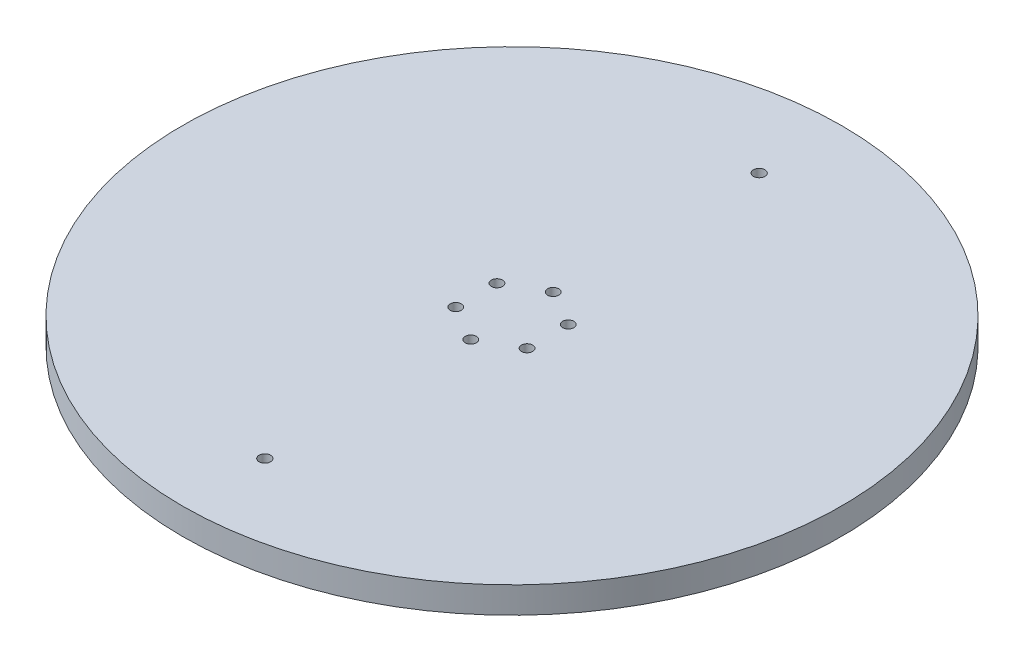
ISO-10303-21;
HEADER;
FILE_DESCRIPTION(('STEP AP214'),'2;1');
FILE_NAME('part.step','',(''),(''),'','','');
FILE_SCHEMA(('AUTOMOTIVE_DESIGN { 1 0 10303 214 1 1 1 1 }'));
ENDSEC;
DATA;
#1=APPLICATION_CONTEXT('core data for automotive mechanical design processes');
#2=APPLICATION_PROTOCOL_DEFINITION('international standard','automotive_design',2000,#1);
#3=PRODUCT_CONTEXT('',#1,'mechanical');
#4=PRODUCT('Part','Part','',(#3));
#5=PRODUCT_RELATED_PRODUCT_CATEGORY('part','',(#4));
#6=PRODUCT_DEFINITION_FORMATION('','',#4);
#7=PRODUCT_DEFINITION_CONTEXT('part definition',#1,'design');
#8=PRODUCT_DEFINITION('design','',#6,#7);
#9=PRODUCT_DEFINITION_SHAPE('','',#8);
#10=(LENGTH_UNIT() NAMED_UNIT(*) SI_UNIT(.MILLI.,.METRE.));
#11=(NAMED_UNIT(*) PLANE_ANGLE_UNIT() SI_UNIT($,.RADIAN.));
#12=(NAMED_UNIT(*) SI_UNIT($,.STERADIAN.) SOLID_ANGLE_UNIT());
#13=UNCERTAINTY_MEASURE_WITH_UNIT(LENGTH_MEASURE(1.E-05),#10,'distance_accuracy_value','');
#14=(GEOMETRIC_REPRESENTATION_CONTEXT(3) GLOBAL_UNCERTAINTY_ASSIGNED_CONTEXT((#13)) GLOBAL_UNIT_ASSIGNED_CONTEXT((#10,
#11,#12)) REPRESENTATION_CONTEXT('',''));
#15=CARTESIAN_POINT('',(0.,0.,0.));
#16=DIRECTION('',(0.,0.,1.));
#17=DIRECTION('',(1.,0.,0.));
#18=AXIS2_PLACEMENT_3D('',#15,#16,#17);
#19=CARTESIAN_POINT('',(0.,16.,0.));
#20=DIRECTION('',(0.,-1.,0.));
#21=DIRECTION('',(0.,0.,-1.));
#22=AXIS2_PLACEMENT_3D('',#19,#20,#21);
#23=CYLINDRICAL_SURFACE('',#22,200.);
#24=CARTESIAN_POINT('',(0.,16.,0.));
#25=DIRECTION('',(0.,1.,0.));
#26=DIRECTION('',(0.,0.,1.));
#27=AXIS2_PLACEMENT_3D('',#24,#25,#26);
#28=CIRCLE('',#27,200.);
#29=CARTESIAN_POINT('',(0.,16.,200.));
#30=VERTEX_POINT('',#29);
#31=EDGE_CURVE('E10',#30,#30,#28,.T.);
#32=ORIENTED_EDGE('',*,*,#31,.F.);
#33=EDGE_LOOP('',(#32));
#34=FACE_BOUND('',#33,.T.);
#35=CARTESIAN_POINT('',(0.,0.,0.));
#36=DIRECTION('',(0.,1.,0.));
#37=DIRECTION('',(0.,0.,1.));
#38=AXIS2_PLACEMENT_3D('',#35,#36,#37);
#39=CIRCLE('',#38,200.);
#40=CARTESIAN_POINT('',(0.,0.,200.));
#41=VERTEX_POINT('',#40);
#42=EDGE_CURVE('E53',#41,#41,#39,.T.);
#43=ORIENTED_EDGE('',*,*,#42,.T.);
#44=EDGE_LOOP('',(#43));
#45=FACE_BOUND('',#44,.T.);
#46=ADVANCED_FACE('F50',(#34,#45),#23,.T.);
#47=CARTESIAN_POINT('',(0.,16.,0.));
#48=DIRECTION('',(0.,1.,0.));
#49=DIRECTION('',(0.,0.,1.));
#50=AXIS2_PLACEMENT_3D('',#47,#48,#49);
#51=PLANE('',#50);
#52=CARTESIAN_POINT('',(0.,16.,-150.));
#53=DIRECTION('',(0.,1.,0.));
#54=DIRECTION('',(0.,0.,1.));
#55=AXIS2_PLACEMENT_3D('',#52,#53,#54);
#56=CIRCLE('',#55,3.49999999999998);
#57=CARTESIAN_POINT('',(0.,16.,-146.5));
#58=VERTEX_POINT('',#57);
#59=EDGE_CURVE('E123',#58,#58,#56,.T.);
#60=ORIENTED_EDGE('',*,*,#59,.F.);
#61=EDGE_LOOP('',(#60));
#62=FACE_BOUND('',#61,.T.);
#63=CARTESIAN_POINT('',(0.,16.,150.));
#64=DIRECTION('',(0.,1.,0.));
#65=DIRECTION('',(0.,0.,1.));
#66=AXIS2_PLACEMENT_3D('',#63,#64,#65);
#67=CIRCLE('',#66,3.49999999999998);
#68=CARTESIAN_POINT('',(0.,16.,153.5));
#69=VERTEX_POINT('',#68);
#70=EDGE_CURVE('E115',#69,#69,#67,.T.);
#71=ORIENTED_EDGE('',*,*,#70,.F.);
#72=EDGE_LOOP('',(#71));
#73=FACE_BOUND('',#72,.T.);
#74=CARTESIAN_POINT('',(21.6506350946108,16.,-12.5000000000003));
#75=DIRECTION('',(0.,1.,0.));
#76=DIRECTION('',(0.,0.,1.));
#77=AXIS2_PLACEMENT_3D('',#74,#75,#76);
#78=CIRCLE('',#77,3.4);
#79=CARTESIAN_POINT('',(21.6506350946108,16.,-9.10000000000025));
#80=VERTEX_POINT('',#79);
#81=EDGE_CURVE('E107',#80,#80,#78,.T.);
#82=ORIENTED_EDGE('',*,*,#81,.F.);
#83=EDGE_LOOP('',(#82));
#84=FACE_BOUND('',#83,.T.);
#85=CARTESIAN_POINT('',(21.6506350946111,16.,12.4999999999998));
#86=DIRECTION('',(0.,1.,0.));
#87=DIRECTION('',(0.,0.,1.));
#88=AXIS2_PLACEMENT_3D('',#85,#86,#87);
#89=CIRCLE('',#88,3.4);
#90=CARTESIAN_POINT('',(21.6506350946111,16.,15.8999999999998));
#91=VERTEX_POINT('',#90);
#92=EDGE_CURVE('E99',#91,#91,#89,.T.);
#93=ORIENTED_EDGE('',*,*,#92,.F.);
#94=EDGE_LOOP('',(#93));
#95=FACE_BOUND('',#94,.T.);
#96=CARTESIAN_POINT('',(0.,16.,25.));
#97=DIRECTION('',(0.,1.,0.));
#98=DIRECTION('',(0.,0.,1.));
#99=AXIS2_PLACEMENT_3D('',#96,#97,#98);
#100=CIRCLE('',#99,3.4);
#101=CARTESIAN_POINT('',(0.,16.,28.4));
#102=VERTEX_POINT('',#101);
#103=EDGE_CURVE('E91',#102,#102,#100,.T.);
#104=ORIENTED_EDGE('',*,*,#103,.F.);
#105=EDGE_LOOP('',(#104));
#106=FACE_BOUND('',#105,.T.);
#107=CARTESIAN_POINT('',(-21.6506350946109,16.,12.5000000000001));
#108=DIRECTION('',(0.,1.,0.));
#109=DIRECTION('',(0.,0.,1.));
#110=AXIS2_PLACEMENT_3D('',#107,#108,#109);
#111=CIRCLE('',#110,3.4);
#112=CARTESIAN_POINT('',(-21.6506350946109,16.,15.9000000000001));
#113=VERTEX_POINT('',#112);
#114=EDGE_CURVE('E83',#113,#113,#111,.T.);
#115=ORIENTED_EDGE('',*,*,#114,.F.);
#116=EDGE_LOOP('',(#115));
#117=FACE_BOUND('',#116,.T.);
#118=CARTESIAN_POINT('',(-21.650635094611,16.,-12.5));
#119=DIRECTION('',(0.,1.,0.));
#120=DIRECTION('',(0.,0.,1.));
#121=AXIS2_PLACEMENT_3D('',#118,#119,#120);
#122=CIRCLE('',#121,3.4);
#123=CARTESIAN_POINT('',(-21.650635094611,16.,-9.09999999999995));
#124=VERTEX_POINT('',#123);
#125=EDGE_CURVE('E75',#124,#124,#122,.T.);
#126=ORIENTED_EDGE('',*,*,#125,.F.);
#127=EDGE_LOOP('',(#126));
#128=FACE_BOUND('',#127,.T.);
#129=CARTESIAN_POINT('',(0.,16.,-25.));
#130=DIRECTION('',(0.,1.,0.));
#131=DIRECTION('',(0.,0.,1.));
#132=AXIS2_PLACEMENT_3D('',#129,#130,#131);
#133=CIRCLE('',#132,3.4);
#134=CARTESIAN_POINT('',(0.,16.,-21.6));
#135=VERTEX_POINT('',#134);
#136=EDGE_CURVE('E67',#135,#135,#133,.T.);
#137=ORIENTED_EDGE('',*,*,#136,.F.);
#138=EDGE_LOOP('',(#137));
#139=FACE_BOUND('',#138,.T.);
#140=ORIENTED_EDGE('',*,*,#31,.T.);
#141=EDGE_LOOP('',(#140));
#142=FACE_BOUND('',#141,.T.);
#143=ADVANCED_FACE('F130',(#62,#73,#84,#95,#106,#117,#128,#139,#142),#51,.T.);
#144=CARTESIAN_POINT('',(0.,0.,0.));
#145=DIRECTION('',(0.,1.,0.));
#146=DIRECTION('',(0.,0.,1.));
#147=AXIS2_PLACEMENT_3D('',#144,#145,#146);
#148=PLANE('',#147);
#149=CARTESIAN_POINT('',(0.,0.,-150.));
#150=DIRECTION('',(0.,1.,0.));
#151=DIRECTION('',(0.,0.,1.));
#152=AXIS2_PLACEMENT_3D('',#149,#150,#151);
#153=CIRCLE('',#152,3.49999999999998);
#154=CARTESIAN_POINT('',(0.,0.,-146.5));
#155=VERTEX_POINT('',#154);
#156=EDGE_CURVE('E119',#155,#155,#153,.T.);
#157=ORIENTED_EDGE('',*,*,#156,.T.);
#158=EDGE_LOOP('',(#157));
#159=FACE_BOUND('',#158,.T.);
#160=CARTESIAN_POINT('',(0.,0.,150.));
#161=DIRECTION('',(0.,1.,0.));
#162=DIRECTION('',(0.,0.,1.));
#163=AXIS2_PLACEMENT_3D('',#160,#161,#162);
#164=CIRCLE('',#163,3.49999999999998);
#165=CARTESIAN_POINT('',(0.,0.,153.5));
#166=VERTEX_POINT('',#165);
#167=EDGE_CURVE('E111',#166,#166,#164,.T.);
#168=ORIENTED_EDGE('',*,*,#167,.T.);
#169=EDGE_LOOP('',(#168));
#170=FACE_BOUND('',#169,.T.);
#171=CARTESIAN_POINT('',(21.6506350946108,0.,-12.5000000000003));
#172=DIRECTION('',(0.,1.,0.));
#173=DIRECTION('',(0.,0.,1.));
#174=AXIS2_PLACEMENT_3D('',#171,#172,#173);
#175=CIRCLE('',#174,3.4);
#176=CARTESIAN_POINT('',(21.6506350946108,0.,-9.10000000000026));
#177=VERTEX_POINT('',#176);
#178=EDGE_CURVE('E103',#177,#177,#175,.T.);
#179=ORIENTED_EDGE('',*,*,#178,.T.);
#180=EDGE_LOOP('',(#179));
#181=FACE_BOUND('',#180,.T.);
#182=CARTESIAN_POINT('',(21.6506350946111,0.,12.4999999999998));
#183=DIRECTION('',(0.,1.,0.));
#184=DIRECTION('',(0.,0.,1.));
#185=AXIS2_PLACEMENT_3D('',#182,#183,#184);
#186=CIRCLE('',#185,3.4);
#187=CARTESIAN_POINT('',(21.6506350946111,0.,15.8999999999998));
#188=VERTEX_POINT('',#187);
#189=EDGE_CURVE('E95',#188,#188,#186,.T.);
#190=ORIENTED_EDGE('',*,*,#189,.T.);
#191=EDGE_LOOP('',(#190));
#192=FACE_BOUND('',#191,.T.);
#193=CARTESIAN_POINT('',(0.,0.,25.));
#194=DIRECTION('',(0.,1.,0.));
#195=DIRECTION('',(0.,0.,1.));
#196=AXIS2_PLACEMENT_3D('',#193,#194,#195);
#197=CIRCLE('',#196,3.4);
#198=CARTESIAN_POINT('',(0.,0.,28.4));
#199=VERTEX_POINT('',#198);
#200=EDGE_CURVE('E87',#199,#199,#197,.T.);
#201=ORIENTED_EDGE('',*,*,#200,.T.);
#202=EDGE_LOOP('',(#201));
#203=FACE_BOUND('',#202,.T.);
#204=CARTESIAN_POINT('',(-21.6506350946109,0.,12.5000000000001));
#205=DIRECTION('',(0.,1.,0.));
#206=DIRECTION('',(0.,0.,1.));
#207=AXIS2_PLACEMENT_3D('',#204,#205,#206);
#208=CIRCLE('',#207,3.4);
#209=CARTESIAN_POINT('',(-21.6506350946109,0.,15.9000000000001));
#210=VERTEX_POINT('',#209);
#211=EDGE_CURVE('E79',#210,#210,#208,.T.);
#212=ORIENTED_EDGE('',*,*,#211,.T.);
#213=EDGE_LOOP('',(#212));
#214=FACE_BOUND('',#213,.T.);
#215=CARTESIAN_POINT('',(-21.650635094611,0.,-12.5));
#216=DIRECTION('',(0.,1.,0.));
#217=DIRECTION('',(0.,0.,1.));
#218=AXIS2_PLACEMENT_3D('',#215,#216,#217);
#219=CIRCLE('',#218,3.4);
#220=CARTESIAN_POINT('',(-21.650635094611,0.,-9.09999999999995));
#221=VERTEX_POINT('',#220);
#222=EDGE_CURVE('E71',#221,#221,#219,.T.);
#223=ORIENTED_EDGE('',*,*,#222,.T.);
#224=EDGE_LOOP('',(#223));
#225=FACE_BOUND('',#224,.T.);
#226=CARTESIAN_POINT('',(0.,0.,-25.));
#227=DIRECTION('',(0.,1.,0.));
#228=DIRECTION('',(0.,0.,1.));
#229=AXIS2_PLACEMENT_3D('',#226,#227,#228);
#230=CIRCLE('',#229,3.4);
#231=CARTESIAN_POINT('',(0.,0.,-21.6));
#232=VERTEX_POINT('',#231);
#233=EDGE_CURVE('E62',#232,#232,#230,.T.);
#234=ORIENTED_EDGE('',*,*,#233,.T.);
#235=EDGE_LOOP('',(#234));
#236=FACE_BOUND('',#235,.T.);
#237=ORIENTED_EDGE('',*,*,#42,.F.);
#238=EDGE_LOOP('',(#237));
#239=FACE_BOUND('',#238,.T.);
#240=ADVANCED_FACE('F133',(#159,#170,#181,#192,#203,#214,#225,#236,#239),#148,.F.);
#241=CARTESIAN_POINT('',(0.,16.,-25.));
#242=DIRECTION('',(0.,1.,0.));
#243=DIRECTION('',(0.,0.,1.));
#244=AXIS2_PLACEMENT_3D('',#241,#242,#243);
#245=CYLINDRICAL_SURFACE('',#244,3.4);
#246=ORIENTED_EDGE('',*,*,#233,.F.);
#247=EDGE_LOOP('',(#246));
#248=FACE_BOUND('',#247,.T.);
#249=ORIENTED_EDGE('',*,*,#136,.T.);
#250=EDGE_LOOP('',(#249));
#251=FACE_BOUND('',#250,.T.);
#252=ADVANCED_FACE('F149',(#248,#251),#245,.F.);
#253=CARTESIAN_POINT('',(-21.650635094611,16.,-12.5));
#254=DIRECTION('',(0.,1.,0.));
#255=DIRECTION('',(0.,0.,1.));
#256=AXIS2_PLACEMENT_3D('',#253,#254,#255);
#257=CYLINDRICAL_SURFACE('',#256,3.4);
#258=ORIENTED_EDGE('',*,*,#222,.F.);
#259=EDGE_LOOP('',(#258));
#260=FACE_BOUND('',#259,.T.);
#261=ORIENTED_EDGE('',*,*,#125,.T.);
#262=EDGE_LOOP('',(#261));
#263=FACE_BOUND('',#262,.T.);
#264=ADVANCED_FACE('F151',(#260,#263),#257,.F.);
#265=CARTESIAN_POINT('',(-21.6506350946109,16.,12.5000000000001));
#266=DIRECTION('',(0.,1.,0.));
#267=DIRECTION('',(0.,0.,1.));
#268=AXIS2_PLACEMENT_3D('',#265,#266,#267);
#269=CYLINDRICAL_SURFACE('',#268,3.4);
#270=ORIENTED_EDGE('',*,*,#211,.F.);
#271=EDGE_LOOP('',(#270));
#272=FACE_BOUND('',#271,.T.);
#273=ORIENTED_EDGE('',*,*,#114,.T.);
#274=EDGE_LOOP('',(#273));
#275=FACE_BOUND('',#274,.T.);
#276=ADVANCED_FACE('F158',(#272,#275),#269,.F.);
#277=CARTESIAN_POINT('',(0.,16.,25.));
#278=DIRECTION('',(0.,1.,0.));
#279=DIRECTION('',(0.,0.,1.));
#280=AXIS2_PLACEMENT_3D('',#277,#278,#279);
#281=CYLINDRICAL_SURFACE('',#280,3.4);
#282=ORIENTED_EDGE('',*,*,#200,.F.);
#283=EDGE_LOOP('',(#282));
#284=FACE_BOUND('',#283,.T.);
#285=ORIENTED_EDGE('',*,*,#103,.T.);
#286=EDGE_LOOP('',(#285));
#287=FACE_BOUND('',#286,.T.);
#288=ADVANCED_FACE('F199',(#284,#287),#281,.F.);
#289=CARTESIAN_POINT('',(21.6506350946111,16.,12.4999999999998));
#290=DIRECTION('',(0.,1.,0.));
#291=DIRECTION('',(0.,0.,1.));
#292=AXIS2_PLACEMENT_3D('',#289,#290,#291);
#293=CYLINDRICAL_SURFACE('',#292,3.4);
#294=ORIENTED_EDGE('',*,*,#189,.F.);
#295=EDGE_LOOP('',(#294));
#296=FACE_BOUND('',#295,.T.);
#297=ORIENTED_EDGE('',*,*,#92,.T.);
#298=EDGE_LOOP('',(#297));
#299=FACE_BOUND('',#298,.T.);
#300=ADVANCED_FACE('F211',(#296,#299),#293,.F.);
#301=CARTESIAN_POINT('',(21.6506350946108,16.,-12.5000000000003));
#302=DIRECTION('',(0.,1.,0.));
#303=DIRECTION('',(0.,0.,1.));
#304=AXIS2_PLACEMENT_3D('',#301,#302,#303);
#305=CYLINDRICAL_SURFACE('',#304,3.4);
#306=ORIENTED_EDGE('',*,*,#178,.F.);
#307=EDGE_LOOP('',(#306));
#308=FACE_BOUND('',#307,.T.);
#309=ORIENTED_EDGE('',*,*,#81,.T.);
#310=EDGE_LOOP('',(#309));
#311=FACE_BOUND('',#310,.T.);
#312=ADVANCED_FACE('F223',(#308,#311),#305,.F.);
#313=CARTESIAN_POINT('',(0.,16.,150.));
#314=DIRECTION('',(0.,1.,0.));
#315=DIRECTION('',(0.,0.,1.));
#316=AXIS2_PLACEMENT_3D('',#313,#314,#315);
#317=CYLINDRICAL_SURFACE('',#316,3.49999999999998);
#318=ORIENTED_EDGE('',*,*,#167,.F.);
#319=EDGE_LOOP('',(#318));
#320=FACE_BOUND('',#319,.T.);
#321=ORIENTED_EDGE('',*,*,#70,.T.);
#322=EDGE_LOOP('',(#321));
#323=FACE_BOUND('',#322,.T.);
#324=ADVANCED_FACE('F234',(#320,#323),#317,.F.);
#325=CARTESIAN_POINT('',(0.,16.,-150.));
#326=DIRECTION('',(0.,1.,0.));
#327=DIRECTION('',(0.,0.,1.));
#328=AXIS2_PLACEMENT_3D('',#325,#326,#327);
#329=CYLINDRICAL_SURFACE('',#328,3.49999999999998);
#330=ORIENTED_EDGE('',*,*,#156,.F.);
#331=EDGE_LOOP('',(#330));
#332=FACE_BOUND('',#331,.T.);
#333=ORIENTED_EDGE('',*,*,#59,.T.);
#334=EDGE_LOOP('',(#333));
#335=FACE_BOUND('',#334,.T.);
#336=ADVANCED_FACE('F128',(#332,#335),#329,.F.);
#337=CLOSED_SHELL('',(#46,#143,#240,#252,#264,#276,#288,#300,#312,#324,#336));
#338=MANIFOLD_SOLID_BREP('B2',#337);
#339=ADVANCED_BREP_SHAPE_REPRESENTATION('',(#18,#338),#14);
#340=SHAPE_DEFINITION_REPRESENTATION(#9,#339);
ENDSEC;
END-ISO-10303-21;
